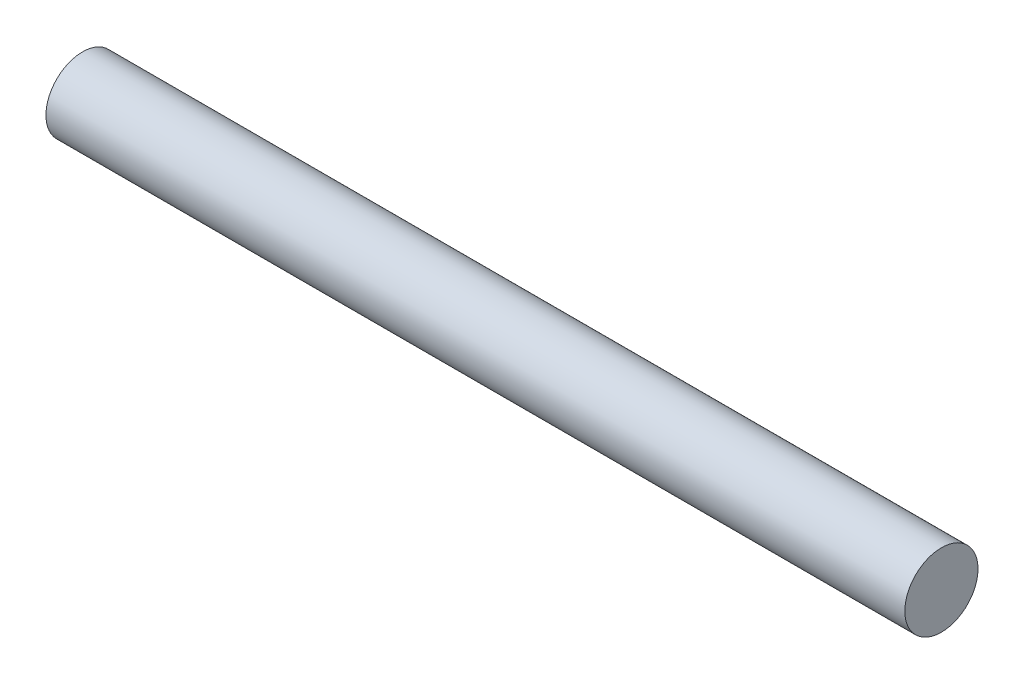
ISO-10303-21;
HEADER;
FILE_DESCRIPTION(('STEP AP214'),'2;1');
FILE_NAME('part.step','',(''),(''),'','','');
FILE_SCHEMA(('AUTOMOTIVE_DESIGN { 1 0 10303 214 1 1 1 1 }'));
ENDSEC;
DATA;
#1=APPLICATION_CONTEXT('core data for automotive mechanical design processes');
#2=APPLICATION_PROTOCOL_DEFINITION('international standard','automotive_design',2000,#1);
#3=PRODUCT_CONTEXT('',#1,'mechanical');
#4=PRODUCT('Part','Part','',(#3));
#5=PRODUCT_RELATED_PRODUCT_CATEGORY('part','',(#4));
#6=PRODUCT_DEFINITION_FORMATION('','',#4);
#7=PRODUCT_DEFINITION_CONTEXT('part definition',#1,'design');
#8=PRODUCT_DEFINITION('design','',#6,#7);
#9=PRODUCT_DEFINITION_SHAPE('','',#8);
#10=(LENGTH_UNIT() NAMED_UNIT(*) SI_UNIT(.MILLI.,.METRE.));
#11=(NAMED_UNIT(*) PLANE_ANGLE_UNIT() SI_UNIT($,.RADIAN.));
#12=(NAMED_UNIT(*) SI_UNIT($,.STERADIAN.) SOLID_ANGLE_UNIT());
#13=UNCERTAINTY_MEASURE_WITH_UNIT(LENGTH_MEASURE(1.E-05),#10,'distance_accuracy_value','');
#14=(GEOMETRIC_REPRESENTATION_CONTEXT(3) GLOBAL_UNCERTAINTY_ASSIGNED_CONTEXT((#13)) GLOBAL_UNIT_ASSIGNED_CONTEXT((#10,
#11,#12)) REPRESENTATION_CONTEXT('',''));
#15=CARTESIAN_POINT('',(0.,0.,0.));
#16=DIRECTION('',(0.,0.,1.));
#17=DIRECTION('',(1.,0.,0.));
#18=AXIS2_PLACEMENT_3D('',#15,#16,#17);
#19=CARTESIAN_POINT('',(58.674,0.,0.));
#20=DIRECTION('',(-1.,0.,0.));
#21=DIRECTION('',(0.,0.,1.));
#22=AXIS2_PLACEMENT_3D('',#19,#20,#21);
#23=CYLINDRICAL_SURFACE('',#22,2.5);
#24=CARTESIAN_POINT('',(58.674,0.,0.));
#25=DIRECTION('',(1.,0.,0.));
#26=DIRECTION('',(0.,0.,-1.));
#27=AXIS2_PLACEMENT_3D('',#24,#25,#26);
#28=CIRCLE('',#27,2.5);
#29=CARTESIAN_POINT('',(58.674,0.,-2.5));
#30=VERTEX_POINT('',#29);
#31=EDGE_CURVE('E10',#30,#30,#28,.T.);
#32=ORIENTED_EDGE('',*,*,#31,.F.);
#33=EDGE_LOOP('',(#32));
#34=FACE_BOUND('',#33,.T.);
#35=CARTESIAN_POINT('',(0.,0.,0.));
#36=DIRECTION('',(1.,0.,0.));
#37=DIRECTION('',(0.,0.,-1.));
#38=AXIS2_PLACEMENT_3D('',#35,#36,#37);
#39=CIRCLE('',#38,2.5);
#40=CARTESIAN_POINT('',(0.,0.,-2.5));
#41=VERTEX_POINT('',#40);
#42=EDGE_CURVE('E34',#41,#41,#39,.T.);
#43=ORIENTED_EDGE('',*,*,#42,.T.);
#44=EDGE_LOOP('',(#43));
#45=FACE_BOUND('',#44,.T.);
#46=ADVANCED_FACE('F31',(#34,#45),#23,.T.);
#47=CARTESIAN_POINT('',(58.674,0.,0.));
#48=DIRECTION('',(1.,0.,0.));
#49=DIRECTION('',(0.,0.,-1.));
#50=AXIS2_PLACEMENT_3D('',#47,#48,#49);
#51=PLANE('',#50);
#52=ORIENTED_EDGE('',*,*,#31,.T.);
#53=EDGE_LOOP('',(#52));
#54=FACE_BOUND('',#53,.T.);
#55=ADVANCED_FACE('F46',(#54),#51,.T.);
#56=CARTESIAN_POINT('',(0.,0.,0.));
#57=DIRECTION('',(1.,0.,0.));
#58=DIRECTION('',(0.,0.,-1.));
#59=AXIS2_PLACEMENT_3D('',#56,#57,#58);
#60=PLANE('',#59);
#61=ORIENTED_EDGE('',*,*,#42,.F.);
#62=EDGE_LOOP('',(#61));
#63=FACE_BOUND('',#62,.T.);
#64=ADVANCED_FACE('F44',(#63),#60,.F.);
#65=CLOSED_SHELL('',(#46,#55,#64));
#66=MANIFOLD_SOLID_BREP('B2',#65);
#67=ADVANCED_BREP_SHAPE_REPRESENTATION('',(#18,#66),#14);
#68=SHAPE_DEFINITION_REPRESENTATION(#9,#67);
ENDSEC;
END-ISO-10303-21;
